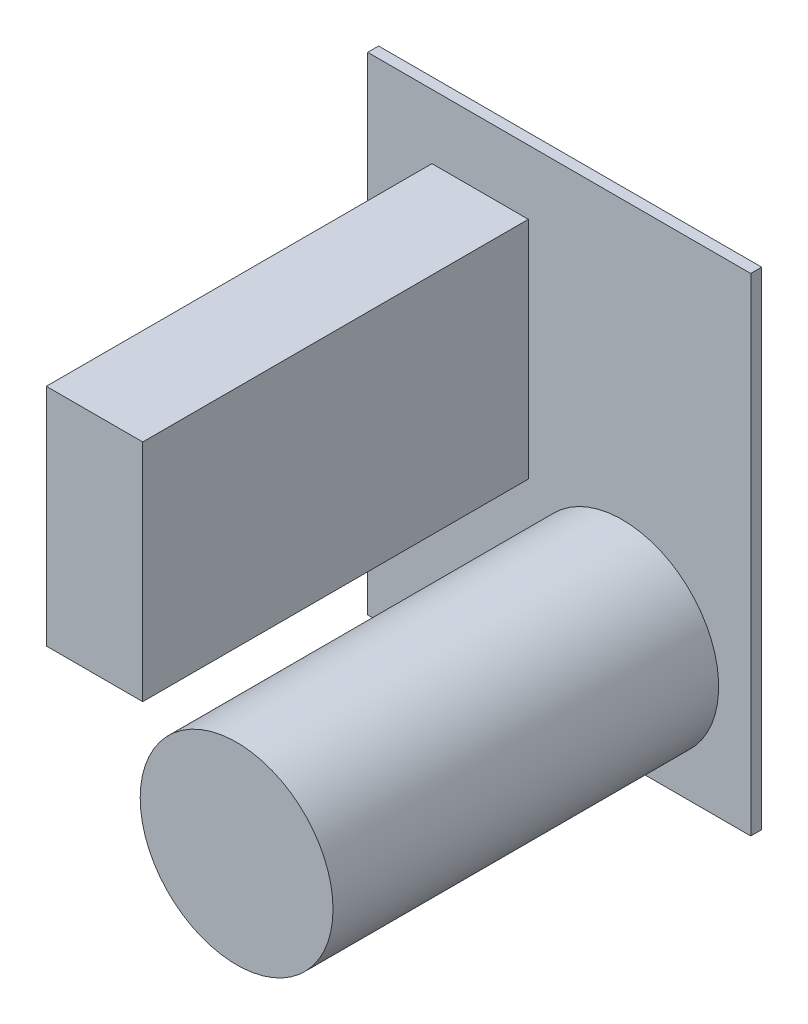
ISO-10303-21;
HEADER;
FILE_DESCRIPTION(('STEP AP214'),'2;1');
FILE_NAME('part.step','',(''),(''),'','','');
FILE_SCHEMA(('AUTOMOTIVE_DESIGN { 1 0 10303 214 1 1 1 1 }'));
ENDSEC;
DATA;
#1=APPLICATION_CONTEXT('core data for automotive mechanical design processes');
#2=APPLICATION_PROTOCOL_DEFINITION('international standard','automotive_design',2000,#1);
#3=PRODUCT_CONTEXT('',#1,'mechanical');
#4=PRODUCT('Part','Part','',(#3));
#5=PRODUCT_RELATED_PRODUCT_CATEGORY('part','',(#4));
#6=PRODUCT_DEFINITION_FORMATION('','',#4);
#7=PRODUCT_DEFINITION_CONTEXT('part definition',#1,'design');
#8=PRODUCT_DEFINITION('design','',#6,#7);
#9=PRODUCT_DEFINITION_SHAPE('','',#8);
#10=(LENGTH_UNIT() NAMED_UNIT(*) SI_UNIT(.MILLI.,.METRE.));
#11=(NAMED_UNIT(*) PLANE_ANGLE_UNIT() SI_UNIT($,.RADIAN.));
#12=(NAMED_UNIT(*) SI_UNIT($,.STERADIAN.) SOLID_ANGLE_UNIT());
#13=UNCERTAINTY_MEASURE_WITH_UNIT(LENGTH_MEASURE(1.E-05),#10,'distance_accuracy_value','');
#14=(GEOMETRIC_REPRESENTATION_CONTEXT(3) GLOBAL_UNCERTAINTY_ASSIGNED_CONTEXT((#13)) GLOBAL_UNIT_ASSIGNED_CONTEXT((#10,
#11,#12)) REPRESENTATION_CONTEXT('',''));
#15=CARTESIAN_POINT('',(0.,0.,0.));
#16=DIRECTION('',(0.,0.,1.));
#17=DIRECTION('',(1.,0.,0.));
#18=AXIS2_PLACEMENT_3D('',#15,#16,#17);
#19=CARTESIAN_POINT('',(0.,0.,1.7));
#20=DIRECTION('',(0.,0.,-1.));
#21=DIRECTION('',(-1.,0.,0.));
#22=AXIS2_PLACEMENT_3D('',#19,#20,#21);
#23=PLANE('',#22);
#24=CARTESIAN_POINT('',(39.6052922453019,17.6394751697024,1.7));
#25=DIRECTION('',(0.,0.,-1.));
#26=DIRECTION('',(-1.,0.,0.));
#27=AXIS2_PLACEMENT_3D('',#24,#25,#26);
#28=CIRCLE('',#27,15.);
#29=CARTESIAN_POINT('',(24.6052922453019,17.6394751697024,1.7));
#30=VERTEX_POINT('',#29);
#31=EDGE_CURVE('E11',#30,#30,#28,.F.);
#32=ORIENTED_EDGE('',*,*,#31,.F.);
#33=EDGE_LOOP('',(#32));
#34=FACE_BOUND('',#33,.T.);
#35=DIRECTION('',(0.,-1.,0.));
#36=VECTOR('',#35,1.);
#37=CARTESIAN_POINT('',(0.,0.,1.7));
#38=LINE('',#37,#36);
#39=CARTESIAN_POINT('',(0.,75.8,1.7));
#40=VERTEX_POINT('',#39);
#41=CARTESIAN_POINT('',(0.,0.,1.7));
#42=VERTEX_POINT('',#41);
#43=EDGE_CURVE('E140',#40,#42,#38,.T.);
#44=ORIENTED_EDGE('',*,*,#43,.T.);
#45=DIRECTION('',(1.,0.,0.));
#46=VECTOR('',#45,1.);
#47=CARTESIAN_POINT('',(0.,0.,1.7));
#48=LINE('',#47,#46);
#49=CARTESIAN_POINT('',(59.6,0.,1.7));
#50=VERTEX_POINT('',#49);
#51=EDGE_CURVE('E144',#42,#50,#48,.T.);
#52=ORIENTED_EDGE('',*,*,#51,.T.);
#53=DIRECTION('',(0.,1.,0.));
#54=VECTOR('',#53,1.);
#55=CARTESIAN_POINT('',(59.6,0.,1.7));
#56=LINE('',#55,#54);
#57=CARTESIAN_POINT('',(59.6,75.8,1.7));
#58=VERTEX_POINT('',#57);
#59=EDGE_CURVE('E148',#50,#58,#56,.T.);
#60=ORIENTED_EDGE('',*,*,#59,.T.);
#61=DIRECTION('',(-1.,0.,0.));
#62=VECTOR('',#61,1.);
#63=CARTESIAN_POINT('',(0.,75.8,1.7));
#64=LINE('',#63,#62);
#65=EDGE_CURVE('E151',#58,#40,#64,.T.);
#66=ORIENTED_EDGE('',*,*,#65,.T.);
#67=EDGE_LOOP('',(#44,#52,#60,#66));
#68=FACE_BOUND('',#67,.T.);
#69=DIRECTION('',(0.,-1.,0.));
#70=VECTOR('',#69,1.);
#71=CARTESIAN_POINT('',(9.99999999999998,65.8,1.70000000000045));
#72=LINE('',#71,#70);
#73=CARTESIAN_POINT('',(9.99999999999998,65.8,1.70000000000045));
#74=VERTEX_POINT('',#73);
#75=CARTESIAN_POINT('',(9.99999999999999,30.8,1.7));
#76=VERTEX_POINT('',#75);
#77=EDGE_CURVE('E127',#74,#76,#72,.T.);
#78=ORIENTED_EDGE('',*,*,#77,.F.);
#79=DIRECTION('',(-1.,0.,0.));
#80=VECTOR('',#79,1.);
#81=CARTESIAN_POINT('',(9.99999999999998,65.8,1.70000000000045));
#82=LINE('',#81,#80);
#83=CARTESIAN_POINT('',(25.,65.8,1.7));
#84=VERTEX_POINT('',#83);
#85=EDGE_CURVE('E124',#84,#74,#82,.T.);
#86=ORIENTED_EDGE('',*,*,#85,.F.);
#87=DIRECTION('',(0.,1.,0.));
#88=VECTOR('',#87,1.);
#89=CARTESIAN_POINT('',(25.,65.8,1.70000000000045));
#90=LINE('',#89,#88);
#91=CARTESIAN_POINT('',(25.,30.8,1.7));
#92=VERTEX_POINT('',#91);
#93=EDGE_CURVE('E60',#92,#84,#90,.T.);
#94=ORIENTED_EDGE('',*,*,#93,.F.);
#95=DIRECTION('',(1.,0.,0.));
#96=VECTOR('',#95,1.);
#97=CARTESIAN_POINT('',(9.99999999999999,30.8,1.70000000000045));
#98=LINE('',#97,#96);
#99=EDGE_CURVE('E55',#76,#92,#98,.T.);
#100=ORIENTED_EDGE('',*,*,#99,.F.);
#101=EDGE_LOOP('',(#78,#86,#94,#100));
#102=FACE_BOUND('',#101,.T.);
#103=ADVANCED_FACE('F39',(#34,#68,#102),#23,.F.);
#104=CARTESIAN_POINT('',(0.,0.,1.7));
#105=DIRECTION('',(1.,0.,0.));
#106=DIRECTION('',(0.,1.,0.));
#107=AXIS2_PLACEMENT_3D('',#104,#105,#106);
#108=PLANE('',#107);
#109=DIRECTION('',(0.,-1.,0.));
#110=VECTOR('',#109,1.);
#111=CARTESIAN_POINT('',(0.,0.,0.));
#112=LINE('',#111,#110);
#113=CARTESIAN_POINT('',(0.,75.8,0.));
#114=VERTEX_POINT('',#113);
#115=CARTESIAN_POINT('',(0.,0.,0.));
#116=VERTEX_POINT('',#115);
#117=EDGE_CURVE('E129',#114,#116,#112,.T.);
#118=ORIENTED_EDGE('',*,*,#117,.T.);
#119=DIRECTION('',(0.,0.,-1.));
#120=VECTOR('',#119,1.);
#121=CARTESIAN_POINT('',(0.,0.,1.7));
#122=LINE('',#121,#120);
#123=EDGE_CURVE('E48',#42,#116,#122,.T.);
#124=ORIENTED_EDGE('',*,*,#123,.F.);
#125=ORIENTED_EDGE('',*,*,#43,.F.);
#126=DIRECTION('',(0.,0.,-1.));
#127=VECTOR('',#126,1.);
#128=CARTESIAN_POINT('',(0.,75.8,1.7));
#129=LINE('',#128,#127);
#130=EDGE_CURVE('E153',#40,#114,#129,.T.);
#131=ORIENTED_EDGE('',*,*,#130,.T.);
#132=EDGE_LOOP('',(#118,#124,#125,#131));
#133=FACE_BOUND('',#132,.T.);
#134=ADVANCED_FACE('F41',(#133),#108,.F.);
#135=CARTESIAN_POINT('',(0.,0.,1.7));
#136=DIRECTION('',(0.,1.,0.));
#137=DIRECTION('',(0.,0.,1.));
#138=AXIS2_PLACEMENT_3D('',#135,#136,#137);
#139=PLANE('',#138);
#140=DIRECTION('',(1.,0.,0.));
#141=VECTOR('',#140,1.);
#142=CARTESIAN_POINT('',(0.,0.,0.));
#143=LINE('',#142,#141);
#144=CARTESIAN_POINT('',(59.6,0.,0.));
#145=VERTEX_POINT('',#144);
#146=EDGE_CURVE('E134',#116,#145,#143,.T.);
#147=ORIENTED_EDGE('',*,*,#146,.T.);
#148=DIRECTION('',(0.,0.,-1.));
#149=VECTOR('',#148,1.);
#150=CARTESIAN_POINT('',(59.6,0.,1.7));
#151=LINE('',#150,#149);
#152=EDGE_CURVE('E169',#50,#145,#151,.T.);
#153=ORIENTED_EDGE('',*,*,#152,.F.);
#154=ORIENTED_EDGE('',*,*,#51,.F.);
#155=ORIENTED_EDGE('',*,*,#123,.T.);
#156=EDGE_LOOP('',(#147,#153,#154,#155));
#157=FACE_BOUND('',#156,.T.);
#158=ADVANCED_FACE('F176',(#157),#139,.F.);
#159=CARTESIAN_POINT('',(59.6,0.,1.7));
#160=DIRECTION('',(-1.,0.,0.));
#161=DIRECTION('',(0.,-1.,0.));
#162=AXIS2_PLACEMENT_3D('',#159,#160,#161);
#163=PLANE('',#162);
#164=DIRECTION('',(0.,1.,0.));
#165=VECTOR('',#164,1.);
#166=CARTESIAN_POINT('',(59.6,0.,0.));
#167=LINE('',#166,#165);
#168=CARTESIAN_POINT('',(59.6,75.8,0.));
#169=VERTEX_POINT('',#168);
#170=EDGE_CURVE('E157',#145,#169,#167,.T.);
#171=ORIENTED_EDGE('',*,*,#170,.T.);
#172=DIRECTION('',(0.,0.,-1.));
#173=VECTOR('',#172,1.);
#174=CARTESIAN_POINT('',(59.6,75.8,1.7));
#175=LINE('',#174,#173);
#176=EDGE_CURVE('E165',#58,#169,#175,.T.);
#177=ORIENTED_EDGE('',*,*,#176,.F.);
#178=ORIENTED_EDGE('',*,*,#59,.F.);
#179=ORIENTED_EDGE('',*,*,#152,.T.);
#180=EDGE_LOOP('',(#171,#177,#178,#179));
#181=FACE_BOUND('',#180,.T.);
#182=ADVANCED_FACE('F188',(#181),#163,.F.);
#183=CARTESIAN_POINT('',(0.,75.8,1.7));
#184=DIRECTION('',(0.,-1.,0.));
#185=DIRECTION('',(0.,0.,-1.));
#186=AXIS2_PLACEMENT_3D('',#183,#184,#185);
#187=PLANE('',#186);
#188=DIRECTION('',(-1.,0.,0.));
#189=VECTOR('',#188,1.);
#190=CARTESIAN_POINT('',(0.,75.8,0.));
#191=LINE('',#190,#189);
#192=EDGE_CURVE('E145',#169,#114,#191,.T.);
#193=ORIENTED_EDGE('',*,*,#192,.T.);
#194=ORIENTED_EDGE('',*,*,#130,.F.);
#195=ORIENTED_EDGE('',*,*,#65,.F.);
#196=ORIENTED_EDGE('',*,*,#176,.T.);
#197=EDGE_LOOP('',(#193,#194,#195,#196));
#198=FACE_BOUND('',#197,.T.);
#199=ADVANCED_FACE('F192',(#198),#187,.F.);
#200=CARTESIAN_POINT('',(0.,0.,0.));
#201=DIRECTION('',(0.,0.,-1.));
#202=DIRECTION('',(-1.,0.,0.));
#203=AXIS2_PLACEMENT_3D('',#200,#201,#202);
#204=PLANE('',#203);
#205=ORIENTED_EDGE('',*,*,#117,.F.);
#206=ORIENTED_EDGE('',*,*,#192,.F.);
#207=ORIENTED_EDGE('',*,*,#170,.F.);
#208=ORIENTED_EDGE('',*,*,#146,.F.);
#209=EDGE_LOOP('',(#205,#206,#207,#208));
#210=FACE_BOUND('',#209,.T.);
#211=ADVANCED_FACE('F184',(#210),#204,.T.);
#212=CARTESIAN_POINT('',(9.99999999999998,65.8,61.7000000000005));
#213=DIRECTION('',(1.,0.,0.));
#214=DIRECTION('',(0.,1.,0.));
#215=AXIS2_PLACEMENT_3D('',#212,#213,#214);
#216=PLANE('',#215);
#217=ORIENTED_EDGE('',*,*,#77,.T.);
#218=DIRECTION('',(0.,0.,-1.));
#219=VECTOR('',#218,1.);
#220=CARTESIAN_POINT('',(9.99999999999999,30.8,61.7000000000005));
#221=LINE('',#220,#219);
#222=CARTESIAN_POINT('',(9.99999999999999,30.8,61.7000000000005));
#223=VERTEX_POINT('',#222);
#224=EDGE_CURVE('E106',#223,#76,#221,.T.);
#225=ORIENTED_EDGE('',*,*,#224,.F.);
#226=DIRECTION('',(0.,-1.,0.));
#227=VECTOR('',#226,1.);
#228=CARTESIAN_POINT('',(9.99999999999998,65.8,61.7000000000005));
#229=LINE('',#228,#227);
#230=CARTESIAN_POINT('',(9.99999999999998,65.8,61.7000000000005));
#231=VERTEX_POINT('',#230);
#232=EDGE_CURVE('E114',#231,#223,#229,.T.);
#233=ORIENTED_EDGE('',*,*,#232,.F.);
#234=DIRECTION('',(0.,0.,-1.));
#235=VECTOR('',#234,1.);
#236=CARTESIAN_POINT('',(9.99999999999998,65.8,61.7000000000005));
#237=LINE('',#236,#235);
#238=EDGE_CURVE('E204',#231,#74,#237,.T.);
#239=ORIENTED_EDGE('',*,*,#238,.T.);
#240=EDGE_LOOP('',(#217,#225,#233,#239));
#241=FACE_BOUND('',#240,.T.);
#242=ADVANCED_FACE('F126',(#241),#216,.F.);
#243=CARTESIAN_POINT('',(9.99999999999999,30.8,61.7000000000005));
#244=DIRECTION('',(0.,1.,0.));
#245=DIRECTION('',(0.,0.,1.));
#246=AXIS2_PLACEMENT_3D('',#243,#244,#245);
#247=PLANE('',#246);
#248=ORIENTED_EDGE('',*,*,#99,.T.);
#249=DIRECTION('',(0.,0.,-1.));
#250=VECTOR('',#249,1.);
#251=CARTESIAN_POINT('',(25.,30.8,61.7000000000005));
#252=LINE('',#251,#250);
#253=CARTESIAN_POINT('',(25.,30.8,61.7000000000005));
#254=VERTEX_POINT('',#253);
#255=EDGE_CURVE('E109',#254,#92,#252,.T.);
#256=ORIENTED_EDGE('',*,*,#255,.F.);
#257=DIRECTION('',(1.,0.,0.));
#258=VECTOR('',#257,1.);
#259=CARTESIAN_POINT('',(9.99999999999999,30.8,61.7000000000005));
#260=LINE('',#259,#258);
#261=EDGE_CURVE('E102',#223,#254,#260,.T.);
#262=ORIENTED_EDGE('',*,*,#261,.F.);
#263=ORIENTED_EDGE('',*,*,#224,.T.);
#264=EDGE_LOOP('',(#248,#256,#262,#263));
#265=FACE_BOUND('',#264,.T.);
#266=ADVANCED_FACE('F104',(#265),#247,.F.);
#267=CARTESIAN_POINT('',(25.,65.8,61.7000000000005));
#268=DIRECTION('',(-1.,0.,0.));
#269=DIRECTION('',(0.,-1.,0.));
#270=AXIS2_PLACEMENT_3D('',#267,#268,#269);
#271=PLANE('',#270);
#272=ORIENTED_EDGE('',*,*,#93,.T.);
#273=DIRECTION('',(0.,0.,-1.));
#274=VECTOR('',#273,1.);
#275=CARTESIAN_POINT('',(25.,65.8,61.7000000000005));
#276=LINE('',#275,#274);
#277=CARTESIAN_POINT('',(25.,65.8,61.7000000000005));
#278=VERTEX_POINT('',#277);
#279=EDGE_CURVE('E136',#278,#84,#276,.T.);
#280=ORIENTED_EDGE('',*,*,#279,.F.);
#281=DIRECTION('',(0.,1.,0.));
#282=VECTOR('',#281,1.);
#283=CARTESIAN_POINT('',(25.,65.8,61.7000000000005));
#284=LINE('',#283,#282);
#285=EDGE_CURVE('E113',#254,#278,#284,.T.);
#286=ORIENTED_EDGE('',*,*,#285,.F.);
#287=ORIENTED_EDGE('',*,*,#255,.T.);
#288=EDGE_LOOP('',(#272,#280,#286,#287));
#289=FACE_BOUND('',#288,.T.);
#290=ADVANCED_FACE('F240',(#289),#271,.F.);
#291=CARTESIAN_POINT('',(9.99999999999998,65.8,61.7000000000005));
#292=DIRECTION('',(0.,-1.,0.));
#293=DIRECTION('',(0.,0.,-1.));
#294=AXIS2_PLACEMENT_3D('',#291,#292,#293);
#295=PLANE('',#294);
#296=ORIENTED_EDGE('',*,*,#85,.T.);
#297=ORIENTED_EDGE('',*,*,#238,.F.);
#298=DIRECTION('',(-1.,0.,0.));
#299=VECTOR('',#298,1.);
#300=CARTESIAN_POINT('',(9.99999999999998,65.8,61.7000000000005));
#301=LINE('',#300,#299);
#302=EDGE_CURVE('E119',#278,#231,#301,.T.);
#303=ORIENTED_EDGE('',*,*,#302,.F.);
#304=ORIENTED_EDGE('',*,*,#279,.T.);
#305=EDGE_LOOP('',(#296,#297,#303,#304));
#306=FACE_BOUND('',#305,.T.);
#307=ADVANCED_FACE('F203',(#306),#295,.F.);
#308=CARTESIAN_POINT('',(0.,0.,61.7000000000005));
#309=DIRECTION('',(0.,0.,1.));
#310=DIRECTION('',(1.,0.,0.));
#311=AXIS2_PLACEMENT_3D('',#308,#309,#310);
#312=PLANE('',#311);
#313=ORIENTED_EDGE('',*,*,#232,.T.);
#314=ORIENTED_EDGE('',*,*,#261,.T.);
#315=ORIENTED_EDGE('',*,*,#285,.T.);
#316=ORIENTED_EDGE('',*,*,#302,.T.);
#317=EDGE_LOOP('',(#313,#314,#315,#316));
#318=FACE_BOUND('',#317,.T.);
#319=ADVANCED_FACE('F117',(#318),#312,.T.);
#320=CARTESIAN_POINT('',(39.6052922453019,17.6394751697024,61.7000000000005));
#321=DIRECTION('',(0.,0.,-1.));
#322=DIRECTION('',(-1.,0.,0.));
#323=AXIS2_PLACEMENT_3D('',#320,#321,#322);
#324=CYLINDRICAL_SURFACE('',#323,15.);
#325=CARTESIAN_POINT('',(39.6052922453019,17.6394751697024,61.7000000000005));
#326=DIRECTION('',(0.,0.,1.));
#327=DIRECTION('',(1.,0.,0.));
#328=AXIS2_PLACEMENT_3D('',#325,#326,#327);
#329=CIRCLE('',#328,15.);
#330=CARTESIAN_POINT('',(54.6052922453019,17.6394751697024,61.7000000000005));
#331=VERTEX_POINT('',#330);
#332=EDGE_CURVE('E199',#331,#331,#329,.T.);
#333=ORIENTED_EDGE('',*,*,#332,.F.);
#334=EDGE_LOOP('',(#333));
#335=FACE_BOUND('',#334,.T.);
#336=ORIENTED_EDGE('',*,*,#31,.T.);
#337=EDGE_LOOP('',(#336));
#338=FACE_BOUND('',#337,.T.);
#339=ADVANCED_FACE('F226',(#335,#338),#324,.T.);
#340=CARTESIAN_POINT('',(39.6052922453019,17.6394751697024,61.7000000000005));
#341=DIRECTION('',(0.,0.,1.));
#342=DIRECTION('',(1.,0.,0.));
#343=AXIS2_PLACEMENT_3D('',#340,#341,#342);
#344=PLANE('',#343);
#345=ORIENTED_EDGE('',*,*,#332,.T.);
#346=EDGE_LOOP('',(#345));
#347=FACE_BOUND('',#346,.T.);
#348=ADVANCED_FACE('F224',(#347),#344,.T.);
#349=CLOSED_SHELL('',(#103,#134,#158,#182,#199,#211,#242,#266,#290,#307,#319,#339,#348));
#350=MANIFOLD_SOLID_BREP('B2',#349);
#351=ADVANCED_BREP_SHAPE_REPRESENTATION('',(#18,#350),#14);
#352=SHAPE_DEFINITION_REPRESENTATION(#9,#351);
ENDSEC;
END-ISO-10303-21;
